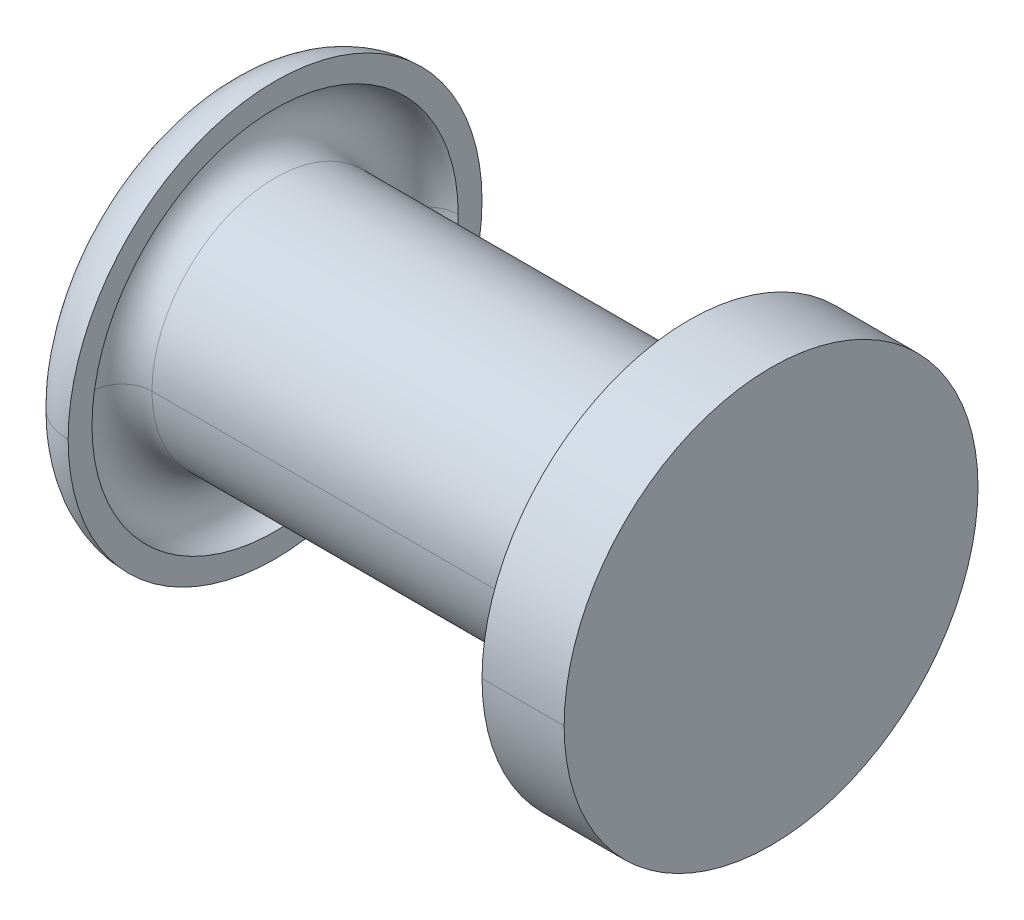
ISO-10303-21;
HEADER;
FILE_DESCRIPTION(('STEP AP214'),'2;1');
FILE_NAME('part.step','',(''),(''),'','','');
FILE_SCHEMA(('AUTOMOTIVE_DESIGN { 1 0 10303 214 1 1 1 1 }'));
ENDSEC;
DATA;
#1=APPLICATION_CONTEXT('core data for automotive mechanical design processes');
#2=APPLICATION_PROTOCOL_DEFINITION('international standard','automotive_design',2000,#1);
#3=PRODUCT_CONTEXT('',#1,'mechanical');
#4=PRODUCT('Part','Part','',(#3));
#5=PRODUCT_RELATED_PRODUCT_CATEGORY('part','',(#4));
#6=PRODUCT_DEFINITION_FORMATION('','',#4);
#7=PRODUCT_DEFINITION_CONTEXT('part definition',#1,'design');
#8=PRODUCT_DEFINITION('design','',#6,#7);
#9=PRODUCT_DEFINITION_SHAPE('','',#8);
#10=(LENGTH_UNIT() NAMED_UNIT(*) SI_UNIT(.MILLI.,.METRE.));
#11=(NAMED_UNIT(*) PLANE_ANGLE_UNIT() SI_UNIT($,.RADIAN.));
#12=(NAMED_UNIT(*) SI_UNIT($,.STERADIAN.) SOLID_ANGLE_UNIT());
#13=UNCERTAINTY_MEASURE_WITH_UNIT(LENGTH_MEASURE(1.E-05),#10,'distance_accuracy_value','');
#14=(GEOMETRIC_REPRESENTATION_CONTEXT(3) GLOBAL_UNCERTAINTY_ASSIGNED_CONTEXT((#13)) GLOBAL_UNIT_ASSIGNED_CONTEXT((#10,
#11,#12)) REPRESENTATION_CONTEXT('',''));
#15=CARTESIAN_POINT('',(0.,0.,0.));
#16=DIRECTION('',(0.,0.,1.));
#17=DIRECTION('',(1.,0.,0.));
#18=AXIS2_PLACEMENT_3D('',#15,#16,#17);
#19=CARTESIAN_POINT('',(5.54355,0.,0.));
#20=DIRECTION('',(-1.,0.,0.));
#21=DIRECTION('',(0.,0.,1.));
#22=AXIS2_PLACEMENT_3D('',#19,#20,#21);
#23=PLANE('',#22);
#24=CARTESIAN_POINT('',(5.54354999999996,0.,0.));
#25=DIRECTION('',(1.,0.,0.));
#26=DIRECTION('',(0.,0.,1.));
#27=AXIS2_PLACEMENT_3D('',#24,#25,#26);
#28=CIRCLE('',#27,3.96875);
#29=CARTESIAN_POINT('',(5.54354999999998,0.,3.96875));
#30=VERTEX_POINT('',#29);
#31=CARTESIAN_POINT('',(5.54354999999998,0.,-3.96875));
#32=VERTEX_POINT('',#31);
#33=EDGE_CURVE('E11',#30,#32,#28,.T.);
#34=ORIENTED_EDGE('',*,*,#33,.T.);
#35=CARTESIAN_POINT('',(5.54354999999996,0.,0.));
#36=DIRECTION('',(1.,0.,0.));
#37=DIRECTION('',(0.,0.,-1.));
#38=AXIS2_PLACEMENT_3D('',#35,#36,#37);
#39=CIRCLE('',#38,3.96875);
#40=EDGE_CURVE('E126',#32,#30,#39,.T.);
#41=ORIENTED_EDGE('',*,*,#40,.T.);
#42=EDGE_LOOP('',(#34,#41));
#43=FACE_BOUND('',#42,.T.);
#44=ADVANCED_FACE('F17',(#43),#23,.F.);
#45=CARTESIAN_POINT('',(33.1437784338811,0.,0.));
#46=DIRECTION('',(1.,0.,0.));
#47=DIRECTION('',(0.,0.,-1.));
#48=AXIS2_PLACEMENT_3D('',#45,#46,#47);
#49=CYLINDRICAL_SURFACE('',#48,3.96875);
#50=CARTESIAN_POINT('',(3.96875000000001,0.,0.));
#51=DIRECTION('',(-1.,0.,0.));
#52=DIRECTION('',(0.,0.,-1.));
#53=AXIS2_PLACEMENT_3D('',#50,#51,#52);
#54=CIRCLE('',#53,3.96875);
#55=CARTESIAN_POINT('',(3.96875000000001,0.,-3.96875));
#56=VERTEX_POINT('',#55);
#57=CARTESIAN_POINT('',(3.96875000000001,0.,3.96875));
#58=VERTEX_POINT('',#57);
#59=EDGE_CURVE('E111',#56,#58,#54,.T.);
#60=ORIENTED_EDGE('',*,*,#59,.F.);
#61=DIRECTION('',(-1.,0.,0.));
#62=VECTOR('',#61,1.);
#63=CARTESIAN_POINT('',(5.54354999999997,0.,-3.96875));
#64=LINE('',#63,#62);
#65=EDGE_CURVE('E117',#32,#56,#64,.T.);
#66=ORIENTED_EDGE('',*,*,#65,.F.);
#67=ORIENTED_EDGE('',*,*,#33,.F.);
#68=DIRECTION('',(-1.,0.,0.));
#69=VECTOR('',#68,1.);
#70=CARTESIAN_POINT('',(5.54354999999997,0.,3.96875));
#71=LINE('',#70,#69);
#72=EDGE_CURVE('E24',#30,#58,#71,.T.);
#73=ORIENTED_EDGE('',*,*,#72,.T.);
#74=EDGE_LOOP('',(#60,#66,#67,#73));
#75=FACE_BOUND('',#74,.T.);
#76=ADVANCED_FACE('F134',(#75),#49,.T.);
#77=CARTESIAN_POINT('',(33.1437784338811,0.,0.));
#78=DIRECTION('',(1.,0.,0.));
#79=DIRECTION('',(0.,0.,-1.));
#80=AXIS2_PLACEMENT_3D('',#77,#78,#79);
#81=CYLINDRICAL_SURFACE('',#80,3.96875);
#82=ORIENTED_EDGE('',*,*,#72,.F.);
#83=ORIENTED_EDGE('',*,*,#40,.F.);
#84=ORIENTED_EDGE('',*,*,#65,.T.);
#85=CARTESIAN_POINT('',(3.96875000000001,0.,0.));
#86=DIRECTION('',(-1.,0.,0.));
#87=DIRECTION('',(0.,0.,1.));
#88=AXIS2_PLACEMENT_3D('',#85,#86,#87);
#89=CIRCLE('',#88,3.96875);
#90=EDGE_CURVE('E112',#58,#56,#89,.T.);
#91=ORIENTED_EDGE('',*,*,#90,.F.);
#92=EDGE_LOOP('',(#82,#83,#84,#91));
#93=FACE_BOUND('',#92,.T.);
#94=ADVANCED_FACE('F140',(#93),#81,.T.);
#95=CARTESIAN_POINT('',(3.96875,-3.96875,0.));
#96=DIRECTION('',(1.,0.,0.));
#97=DIRECTION('',(0.,0.,-1.));
#98=AXIS2_PLACEMENT_3D('',#95,#96,#97);
#99=PLANE('',#98);
#100=CARTESIAN_POINT('',(3.96875000000001,0.,0.));
#101=DIRECTION('',(1.,0.,0.));
#102=DIRECTION('',(0.,0.,1.));
#103=AXIS2_PLACEMENT_3D('',#100,#101,#102);
#104=CIRCLE('',#103,2.3622);
#105=CARTESIAN_POINT('',(3.96875000000001,0.,2.3622));
#106=VERTEX_POINT('',#105);
#107=CARTESIAN_POINT('',(3.96875000000001,0.,-2.3622));
#108=VERTEX_POINT('',#107);
#109=EDGE_CURVE('E121',#106,#108,#104,.T.);
#110=ORIENTED_EDGE('',*,*,#109,.T.);
#111=CARTESIAN_POINT('',(3.96875000000001,0.,0.));
#112=DIRECTION('',(1.,0.,0.));
#113=DIRECTION('',(0.,0.,-1.));
#114=AXIS2_PLACEMENT_3D('',#111,#112,#113);
#115=CIRCLE('',#114,2.3622);
#116=EDGE_CURVE('E119',#108,#106,#115,.T.);
#117=ORIENTED_EDGE('',*,*,#116,.T.);
#118=EDGE_LOOP('',(#110,#117));
#119=FACE_BOUND('',#118,.T.);
#120=ORIENTED_EDGE('',*,*,#59,.T.);
#121=ORIENTED_EDGE('',*,*,#90,.T.);
#122=EDGE_LOOP('',(#120,#121));
#123=FACE_BOUND('',#122,.T.);
#124=ADVANCED_FACE('F136',(#119,#123),#99,.F.);
#125=CARTESIAN_POINT('',(-0.449210520752796,0.,0.));
#126=DIRECTION('',(-1.,0.,0.));
#127=DIRECTION('',(0.,0.,1.));
#128=AXIS2_PLACEMENT_3D('',#125,#126,#127);
#129=CONICAL_SURFACE('',#128,0.,1.02974425867666);
#130=DIRECTION('',(0.515038074910051,0.,-0.857167300702114));
#131=VECTOR('',#130,1.);
#132=CARTESIAN_POINT('',(-1.59385000000021,0.,1.90499999999987));
#133=LINE('',#132,#131);
#134=CARTESIAN_POINT('',(-1.59385000000011,0.,1.90499999999994));
#135=VERTEX_POINT('',#134);
#136=CARTESIAN_POINT('',(-0.449210520752796,0.,0.));
#137=VERTEX_POINT('',#136);
#138=EDGE_CURVE('E79',#135,#137,#133,.T.);
#139=ORIENTED_EDGE('',*,*,#138,.F.);
#140=CARTESIAN_POINT('',(-1.59385000000021,0.,0.));
#141=DIRECTION('',(-1.,0.,0.));
#142=DIRECTION('',(0.,0.,1.));
#143=AXIS2_PLACEMENT_3D('',#140,#141,#142);
#144=CIRCLE('',#143,1.90499999999987);
#145=CARTESIAN_POINT('',(-1.59385000000011,0.,-1.90499999999994));
#146=VERTEX_POINT('',#145);
#147=EDGE_CURVE('E81',#135,#146,#144,.T.);
#148=ORIENTED_EDGE('',*,*,#147,.T.);
#149=DIRECTION('',(0.515038074910051,0.,0.857167300702114));
#150=VECTOR('',#149,1.);
#151=CARTESIAN_POINT('',(-1.59385000000021,0.,-1.90499999999987));
#152=LINE('',#151,#150);
#153=EDGE_CURVE('E33',#146,#137,#152,.T.);
#154=ORIENTED_EDGE('',*,*,#153,.T.);
#155=EDGE_LOOP('',(#139,#148,#154));
#156=FACE_BOUND('',#155,.T.);
#157=ADVANCED_FACE('F85',(#156),#129,.F.);
#158=CARTESIAN_POINT('',(-0.449210520752796,0.,0.));
#159=DIRECTION('',(-1.,0.,0.));
#160=DIRECTION('',(0.,0.,1.));
#161=AXIS2_PLACEMENT_3D('',#158,#159,#160);
#162=CONICAL_SURFACE('',#161,0.,1.02974425867666);
#163=ORIENTED_EDGE('',*,*,#153,.F.);
#164=CARTESIAN_POINT('',(-1.59385000000021,0.,0.));
#165=DIRECTION('',(-1.,0.,0.));
#166=DIRECTION('',(0.,0.,-1.));
#167=AXIS2_PLACEMENT_3D('',#164,#165,#166);
#168=CIRCLE('',#167,1.90499999999987);
#169=EDGE_CURVE('E88',#146,#135,#168,.T.);
#170=ORIENTED_EDGE('',*,*,#169,.T.);
#171=ORIENTED_EDGE('',*,*,#138,.T.);
#172=EDGE_LOOP('',(#163,#170,#171));
#173=FACE_BOUND('',#172,.T.);
#174=ADVANCED_FACE('F89',(#173),#162,.F.);
#175=CARTESIAN_POINT('',(-3.96875,0.,0.));
#176=DIRECTION('',(1.,0.,0.));
#177=DIRECTION('',(0.,0.,-1.));
#178=AXIS2_PLACEMENT_3D('',#175,#176,#177);
#179=TOROIDAL_SURFACE('',#178,2.936875,1.031875);
#180=CARTESIAN_POINT('',(-3.96875,0.,0.));
#181=DIRECTION('',(1.,0.,0.));
#182=DIRECTION('',(0.,0.,1.));
#183=AXIS2_PLACEMENT_3D('',#180,#181,#182);
#184=CIRCLE('',#183,1.905);
#185=CARTESIAN_POINT('',(-3.96875,0.,1.905));
#186=VERTEX_POINT('',#185);
#187=CARTESIAN_POINT('',(-3.96875,0.,-1.905));
#188=VERTEX_POINT('',#187);
#189=EDGE_CURVE('E94',#186,#188,#184,.T.);
#190=ORIENTED_EDGE('',*,*,#189,.T.);
#191=CARTESIAN_POINT('',(-3.96875,0.,-2.936875));
#192=DIRECTION('',(0.,1.,0.));
#193=DIRECTION('',(0.,0.,-1.));
#194=AXIS2_PLACEMENT_3D('',#191,#192,#193);
#195=CIRCLE('',#194,1.031875);
#196=CARTESIAN_POINT('',(-3.96875,0.,-3.96875));
#197=VERTEX_POINT('',#196);
#198=EDGE_CURVE('E404',#197,#188,#195,.T.);
#199=ORIENTED_EDGE('',*,*,#198,.F.);
#200=CARTESIAN_POINT('',(-3.96875,0.,0.));
#201=DIRECTION('',(1.,0.,0.));
#202=DIRECTION('',(0.,0.,1.));
#203=AXIS2_PLACEMENT_3D('',#200,#201,#202);
#204=CIRCLE('',#203,3.96875);
#205=CARTESIAN_POINT('',(-3.96875,0.,3.96875));
#206=VERTEX_POINT('',#205);
#207=EDGE_CURVE('E397',#206,#197,#204,.T.);
#208=ORIENTED_EDGE('',*,*,#207,.F.);
#209=CARTESIAN_POINT('',(-3.96875,0.,2.936875));
#210=DIRECTION('',(0.,-1.,0.));
#211=DIRECTION('',(0.,0.,1.));
#212=AXIS2_PLACEMENT_3D('',#209,#210,#211);
#213=CIRCLE('',#212,1.031875);
#214=EDGE_CURVE('E103',#206,#186,#213,.T.);
#215=ORIENTED_EDGE('',*,*,#214,.T.);
#216=EDGE_LOOP('',(#190,#199,#208,#215));
#217=FACE_BOUND('',#216,.T.);
#218=ADVANCED_FACE('F184',(#217),#179,.T.);
#219=CARTESIAN_POINT('',(33.1437784338811,0.,0.));
#220=DIRECTION('',(1.,0.,0.));
#221=DIRECTION('',(0.,0.,-1.));
#222=AXIS2_PLACEMENT_3D('',#219,#220,#221);
#223=CYLINDRICAL_SURFACE('',#222,1.905);
#224=DIRECTION('',(-1.,0.,0.));
#225=VECTOR('',#224,1.);
#226=CARTESIAN_POINT('',(-1.59385000000001,0.,1.905));
#227=LINE('',#226,#225);
#228=EDGE_CURVE('E98',#135,#186,#227,.T.);
#229=ORIENTED_EDGE('',*,*,#228,.F.);
#230=ORIENTED_EDGE('',*,*,#169,.F.);
#231=DIRECTION('',(-1.,0.,0.));
#232=VECTOR('',#231,1.);
#233=CARTESIAN_POINT('',(-1.59385000000001,0.,-1.905));
#234=LINE('',#233,#232);
#235=EDGE_CURVE('E106',#146,#188,#234,.T.);
#236=ORIENTED_EDGE('',*,*,#235,.T.);
#237=ORIENTED_EDGE('',*,*,#189,.F.);
#238=EDGE_LOOP('',(#229,#230,#236,#237));
#239=FACE_BOUND('',#238,.T.);
#240=ADVANCED_FACE('F97',(#239),#223,.F.);
#241=CARTESIAN_POINT('',(33.1437784338811,0.,0.));
#242=DIRECTION('',(1.,0.,0.));
#243=DIRECTION('',(0.,0.,-1.));
#244=AXIS2_PLACEMENT_3D('',#241,#242,#243);
#245=CYLINDRICAL_SURFACE('',#244,1.905);
#246=CARTESIAN_POINT('',(-3.96875,0.,0.));
#247=DIRECTION('',(1.,0.,0.));
#248=DIRECTION('',(0.,0.,-1.));
#249=AXIS2_PLACEMENT_3D('',#246,#247,#248);
#250=CIRCLE('',#249,1.905);
#251=EDGE_CURVE('E401',#188,#186,#250,.T.);
#252=ORIENTED_EDGE('',*,*,#251,.F.);
#253=ORIENTED_EDGE('',*,*,#235,.F.);
#254=ORIENTED_EDGE('',*,*,#147,.F.);
#255=ORIENTED_EDGE('',*,*,#228,.T.);
#256=EDGE_LOOP('',(#252,#253,#254,#255));
#257=FACE_BOUND('',#256,.T.);
#258=ADVANCED_FACE('F104',(#257),#245,.F.);
#259=CARTESIAN_POINT('',(-3.96875,0.,0.));
#260=DIRECTION('',(1.,0.,0.));
#261=DIRECTION('',(0.,0.,-1.));
#262=AXIS2_PLACEMENT_3D('',#259,#260,#261);
#263=TOROIDAL_SURFACE('',#262,2.936875,1.031875);
#264=ORIENTED_EDGE('',*,*,#214,.F.);
#265=CARTESIAN_POINT('',(-3.96875,0.,0.));
#266=DIRECTION('',(1.,0.,0.));
#267=DIRECTION('',(0.,0.,-1.));
#268=AXIS2_PLACEMENT_3D('',#265,#266,#267);
#269=CIRCLE('',#268,3.96875);
#270=EDGE_CURVE('E396',#197,#206,#269,.T.);
#271=ORIENTED_EDGE('',*,*,#270,.F.);
#272=ORIENTED_EDGE('',*,*,#198,.T.);
#273=ORIENTED_EDGE('',*,*,#251,.T.);
#274=EDGE_LOOP('',(#264,#271,#272,#273));
#275=FACE_BOUND('',#274,.T.);
#276=ADVANCED_FACE('F211',(#275),#263,.T.);
#277=CARTESIAN_POINT('',(-3.96875,-3.51155,0.));
#278=DIRECTION('',(-1.,0.,0.));
#279=DIRECTION('',(0.,0.,1.));
#280=AXIS2_PLACEMENT_3D('',#277,#278,#279);
#281=PLANE('',#280);
#282=CARTESIAN_POINT('',(-3.96875,0.,0.));
#283=DIRECTION('',(-1.,0.,0.));
#284=DIRECTION('',(0.,0.,-1.));
#285=AXIS2_PLACEMENT_3D('',#282,#283,#284);
#286=CIRCLE('',#285,3.51155);
#287=CARTESIAN_POINT('',(-3.96875,0.,-3.51155));
#288=VERTEX_POINT('',#287);
#289=CARTESIAN_POINT('',(-3.96875,0.,3.51155));
#290=VERTEX_POINT('',#289);
#291=EDGE_CURVE('E383',#288,#290,#286,.T.);
#292=ORIENTED_EDGE('',*,*,#291,.T.);
#293=CARTESIAN_POINT('',(-3.96875,0.,0.));
#294=DIRECTION('',(-1.,0.,0.));
#295=DIRECTION('',(0.,0.,1.));
#296=AXIS2_PLACEMENT_3D('',#293,#294,#295);
#297=CIRCLE('',#296,3.51155);
#298=EDGE_CURVE('E36',#290,#288,#297,.T.);
#299=ORIENTED_EDGE('',*,*,#298,.T.);
#300=EDGE_LOOP('',(#292,#299));
#301=FACE_BOUND('',#300,.T.);
#302=ORIENTED_EDGE('',*,*,#207,.T.);
#303=ORIENTED_EDGE('',*,*,#270,.T.);
#304=EDGE_LOOP('',(#302,#303));
#305=FACE_BOUND('',#304,.T.);
#306=ADVANCED_FACE('F219',(#301,#305),#281,.F.);
#307=CARTESIAN_POINT('',(-3.96875,0.,0.));
#308=DIRECTION('',(1.,0.,0.));
#309=DIRECTION('',(0.,0.,-1.));
#310=AXIS2_PLACEMENT_3D('',#307,#308,#309);
#311=TOROIDAL_SURFACE('',#310,2.936875,0.574675);
#312=CARTESIAN_POINT('',(-3.96875,0.,0.));
#313=DIRECTION('',(-1.,0.,0.));
#314=DIRECTION('',(0.,0.,1.));
#315=AXIS2_PLACEMENT_3D('',#312,#313,#314);
#316=CIRCLE('',#315,2.3622);
#317=CARTESIAN_POINT('',(-3.96875,0.,2.3622));
#318=VERTEX_POINT('',#317);
#319=CARTESIAN_POINT('',(-3.96875,0.,-2.3622));
#320=VERTEX_POINT('',#319);
#321=EDGE_CURVE('E120',#318,#320,#316,.T.);
#322=ORIENTED_EDGE('',*,*,#321,.T.);
#323=CARTESIAN_POINT('',(-3.96875,0.,-2.936875));
#324=DIRECTION('',(0.,1.,0.));
#325=DIRECTION('',(0.,0.,-1.));
#326=AXIS2_PLACEMENT_3D('',#323,#324,#325);
#327=CIRCLE('',#326,0.574675);
#328=EDGE_CURVE('E391',#288,#320,#327,.T.);
#329=ORIENTED_EDGE('',*,*,#328,.F.);
#330=ORIENTED_EDGE('',*,*,#298,.F.);
#331=CARTESIAN_POINT('',(-3.96875,0.,2.936875));
#332=DIRECTION('',(0.,-1.,0.));
#333=DIRECTION('',(0.,0.,1.));
#334=AXIS2_PLACEMENT_3D('',#331,#332,#333);
#335=CIRCLE('',#334,0.574675);
#336=EDGE_CURVE('E385',#290,#318,#335,.T.);
#337=ORIENTED_EDGE('',*,*,#336,.T.);
#338=EDGE_LOOP('',(#322,#329,#330,#337));
#339=FACE_BOUND('',#338,.T.);
#340=ADVANCED_FACE('F230',(#339),#311,.F.);
#341=CARTESIAN_POINT('',(33.1437784338811,0.,0.));
#342=DIRECTION('',(1.,0.,0.));
#343=DIRECTION('',(0.,0.,-1.));
#344=AXIS2_PLACEMENT_3D('',#341,#342,#343);
#345=CYLINDRICAL_SURFACE('',#344,2.3622);
#346=DIRECTION('',(-1.,0.,0.));
#347=VECTOR('',#346,1.);
#348=CARTESIAN_POINT('',(3.96875000000001,0.,2.3622));
#349=LINE('',#348,#347);
#350=EDGE_CURVE('E122',#106,#318,#349,.T.);
#351=ORIENTED_EDGE('',*,*,#350,.F.);
#352=ORIENTED_EDGE('',*,*,#116,.F.);
#353=DIRECTION('',(-1.,0.,0.));
#354=VECTOR('',#353,1.);
#355=CARTESIAN_POINT('',(3.96875000000001,0.,-2.3622));
#356=LINE('',#355,#354);
#357=EDGE_CURVE('E123',#108,#320,#356,.T.);
#358=ORIENTED_EDGE('',*,*,#357,.T.);
#359=ORIENTED_EDGE('',*,*,#321,.F.);
#360=EDGE_LOOP('',(#351,#352,#358,#359));
#361=FACE_BOUND('',#360,.T.);
#362=ADVANCED_FACE('F237',(#361),#345,.T.);
#363=CARTESIAN_POINT('',(33.1437784338811,0.,0.));
#364=DIRECTION('',(1.,0.,0.));
#365=DIRECTION('',(0.,0.,-1.));
#366=AXIS2_PLACEMENT_3D('',#363,#364,#365);
#367=CYLINDRICAL_SURFACE('',#366,2.3622);
#368=CARTESIAN_POINT('',(-3.96875,0.,0.));
#369=DIRECTION('',(-1.,0.,0.));
#370=DIRECTION('',(0.,0.,-1.));
#371=AXIS2_PLACEMENT_3D('',#368,#369,#370);
#372=CIRCLE('',#371,2.3622);
#373=EDGE_CURVE('E387',#320,#318,#372,.T.);
#374=ORIENTED_EDGE('',*,*,#373,.F.);
#375=ORIENTED_EDGE('',*,*,#357,.F.);
#376=ORIENTED_EDGE('',*,*,#109,.F.);
#377=ORIENTED_EDGE('',*,*,#350,.T.);
#378=EDGE_LOOP('',(#374,#375,#376,#377));
#379=FACE_BOUND('',#378,.T.);
#380=ADVANCED_FACE('F246',(#379),#367,.T.);
#381=CARTESIAN_POINT('',(-3.96875,0.,0.));
#382=DIRECTION('',(1.,0.,0.));
#383=DIRECTION('',(0.,0.,-1.));
#384=AXIS2_PLACEMENT_3D('',#381,#382,#383);
#385=TOROIDAL_SURFACE('',#384,2.936875,0.574675);
#386=ORIENTED_EDGE('',*,*,#336,.F.);
#387=ORIENTED_EDGE('',*,*,#291,.F.);
#388=ORIENTED_EDGE('',*,*,#328,.T.);
#389=ORIENTED_EDGE('',*,*,#373,.T.);
#390=EDGE_LOOP('',(#386,#387,#388,#389));
#391=FACE_BOUND('',#390,.T.);
#392=ADVANCED_FACE('F259',(#391),#385,.F.);
#393=CLOSED_SHELL('',(#44,#76,#94,#124,#157,#174,#218,#240,#258,#276,#306,#340,#362,#380,#392));
#394=MANIFOLD_SOLID_BREP('B1',#393);
#395=ADVANCED_BREP_SHAPE_REPRESENTATION('',(#18,#394),#14);
#396=SHAPE_DEFINITION_REPRESENTATION(#9,#395);
ENDSEC;
END-ISO-10303-21;
